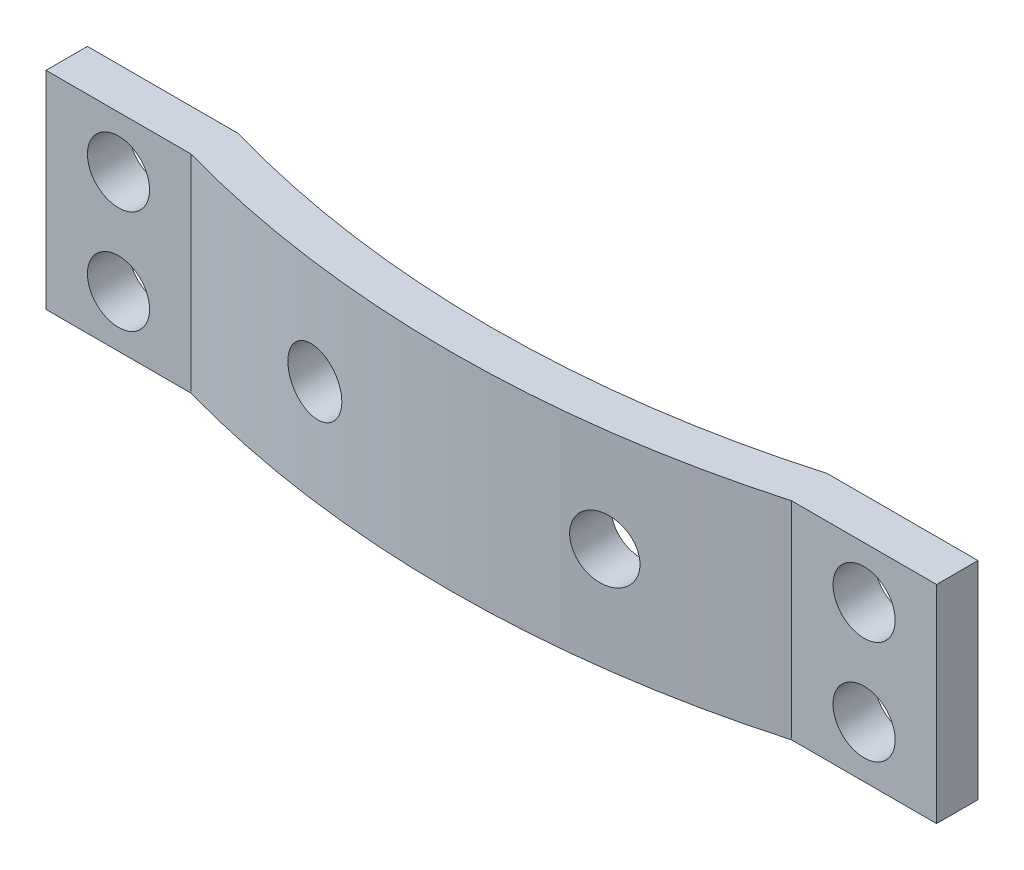
ISO-10303-21;
HEADER;
FILE_DESCRIPTION(('STEP AP214'),'2;1');
FILE_NAME('part.step','',(''),(''),'','','');
FILE_SCHEMA(('AUTOMOTIVE_DESIGN { 1 0 10303 214 1 1 1 1 }'));
ENDSEC;
DATA;
#1=APPLICATION_CONTEXT('core data for automotive mechanical design processes');
#2=APPLICATION_PROTOCOL_DEFINITION('international standard','automotive_design',2000,#1);
#3=PRODUCT_CONTEXT('',#1,'mechanical');
#4=PRODUCT('Part','Part','',(#3));
#5=PRODUCT_RELATED_PRODUCT_CATEGORY('part','',(#4));
#6=PRODUCT_DEFINITION_FORMATION('','',#4);
#7=PRODUCT_DEFINITION_CONTEXT('part definition',#1,'design');
#8=PRODUCT_DEFINITION('design','',#6,#7);
#9=PRODUCT_DEFINITION_SHAPE('','',#8);
#10=(LENGTH_UNIT() NAMED_UNIT(*) SI_UNIT(.MILLI.,.METRE.));
#11=(NAMED_UNIT(*) PLANE_ANGLE_UNIT() SI_UNIT($,.RADIAN.));
#12=(NAMED_UNIT(*) SI_UNIT($,.STERADIAN.) SOLID_ANGLE_UNIT());
#13=UNCERTAINTY_MEASURE_WITH_UNIT(LENGTH_MEASURE(1.E-05),#10,'distance_accuracy_value','');
#14=(GEOMETRIC_REPRESENTATION_CONTEXT(3) GLOBAL_UNCERTAINTY_ASSIGNED_CONTEXT((#13)) GLOBAL_UNIT_ASSIGNED_CONTEXT((#10,
#11,#12)) REPRESENTATION_CONTEXT('',''));
#15=CARTESIAN_POINT('',(0.,0.,0.));
#16=DIRECTION('',(0.,0.,1.));
#17=DIRECTION('',(1.,0.,0.));
#18=AXIS2_PLACEMENT_3D('',#15,#16,#17);
#19=CARTESIAN_POINT('',(-36.,10.,-2.));
#20=DIRECTION('',(0.,0.,1.));
#21=DIRECTION('',(1.,0.,0.));
#22=AXIS2_PLACEMENT_3D('',#19,#20,#21);
#23=PLANE('',#22);
#24=CARTESIAN_POINT('',(-39.5,2.5,-2.));
#25=DIRECTION('',(0.,0.,1.));
#26=DIRECTION('',(1.,0.,0.));
#27=AXIS2_PLACEMENT_3D('',#24,#25,#26);
#28=CIRCLE('',#27,1.5);
#29=CARTESIAN_POINT('',(-38.,2.5,-2.));
#30=VERTEX_POINT('',#29);
#31=EDGE_CURVE('E194',#30,#30,#28,.T.);
#32=ORIENTED_EDGE('',*,*,#31,.T.);
#33=EDGE_LOOP('',(#32));
#34=FACE_BOUND('',#33,.T.);
#35=CARTESIAN_POINT('',(-39.5,7.5,-2.));
#36=DIRECTION('',(0.,0.,1.));
#37=DIRECTION('',(1.,0.,0.));
#38=AXIS2_PLACEMENT_3D('',#35,#36,#37);
#39=CIRCLE('',#38,1.5);
#40=CARTESIAN_POINT('',(-38.,7.5,-2.));
#41=VERTEX_POINT('',#40);
#42=EDGE_CURVE('E141',#41,#41,#39,.T.);
#43=ORIENTED_EDGE('',*,*,#42,.T.);
#44=EDGE_LOOP('',(#43));
#45=FACE_BOUND('',#44,.T.);
#46=DIRECTION('',(-1.,0.,0.));
#47=VECTOR('',#46,1.);
#48=CARTESIAN_POINT('',(-36.,0.,-2.));
#49=LINE('',#48,#47);
#50=CARTESIAN_POINT('',(-35.7214626533279,0.,-2.));
#51=VERTEX_POINT('',#50);
#52=CARTESIAN_POINT('',(-43.,0.,-2.));
#53=VERTEX_POINT('',#52);
#54=EDGE_CURVE('E137',#51,#53,#49,.T.);
#55=ORIENTED_EDGE('',*,*,#54,.T.);
#56=DIRECTION('',(0.,-1.,0.));
#57=VECTOR('',#56,1.);
#58=CARTESIAN_POINT('',(-43.,10.,-2.));
#59=LINE('',#58,#57);
#60=CARTESIAN_POINT('',(-43.,10.,-2.));
#61=VERTEX_POINT('',#60);
#62=EDGE_CURVE('E11',#61,#53,#59,.T.);
#63=ORIENTED_EDGE('',*,*,#62,.F.);
#64=DIRECTION('',(-1.,0.,0.));
#65=VECTOR('',#64,1.);
#66=CARTESIAN_POINT('',(-36.,10.,-2.));
#67=LINE('',#66,#65);
#68=CARTESIAN_POINT('',(-35.7214626533279,10.,-2.));
#69=VERTEX_POINT('',#68);
#70=EDGE_CURVE('E95',#69,#61,#67,.T.);
#71=ORIENTED_EDGE('',*,*,#70,.F.);
#72=DIRECTION('',(0.,-1.,0.));
#73=VECTOR('',#72,1.);
#74=CARTESIAN_POINT('',(-35.7214626533279,10.,-2.));
#75=LINE('',#74,#73);
#76=EDGE_CURVE('E136',#69,#51,#75,.T.);
#77=ORIENTED_EDGE('',*,*,#76,.T.);
#78=EDGE_LOOP('',(#55,#63,#71,#77));
#79=FACE_BOUND('',#78,.T.);
#80=ADVANCED_FACE('F34',(#34,#45,#79),#23,.F.);
#81=CARTESIAN_POINT('',(-43.,10.,0.));
#82=DIRECTION('',(-1.,0.,0.));
#83=DIRECTION('',(0.,0.,1.));
#84=AXIS2_PLACEMENT_3D('',#81,#82,#83);
#85=PLANE('',#84);
#86=DIRECTION('',(0.,0.,-1.));
#87=VECTOR('',#86,1.);
#88=CARTESIAN_POINT('',(-43.,0.,0.));
#89=LINE('',#88,#87);
#90=CARTESIAN_POINT('',(-43.,0.,0.));
#91=VERTEX_POINT('',#90);
#92=EDGE_CURVE('E140',#91,#53,#89,.T.);
#93=ORIENTED_EDGE('',*,*,#92,.F.);
#94=DIRECTION('',(0.,-1.,0.));
#95=VECTOR('',#94,1.);
#96=CARTESIAN_POINT('',(-43.,10.,0.));
#97=LINE('',#96,#95);
#98=CARTESIAN_POINT('',(-43.,10.,0.));
#99=VERTEX_POINT('',#98);
#100=EDGE_CURVE('E47',#99,#91,#97,.T.);
#101=ORIENTED_EDGE('',*,*,#100,.F.);
#102=DIRECTION('',(0.,0.,-1.));
#103=VECTOR('',#102,1.);
#104=CARTESIAN_POINT('',(-43.,10.,0.));
#105=LINE('',#104,#103);
#106=EDGE_CURVE('E227',#99,#61,#105,.T.);
#107=ORIENTED_EDGE('',*,*,#106,.T.);
#108=ORIENTED_EDGE('',*,*,#62,.T.);
#109=EDGE_LOOP('',(#93,#101,#107,#108));
#110=FACE_BOUND('',#109,.T.);
#111=ADVANCED_FACE('F207',(#110),#85,.T.);
#112=CARTESIAN_POINT('',(-36.,10.,0.));
#113=DIRECTION('',(0.,0.,1.));
#114=DIRECTION('',(1.,0.,0.));
#115=AXIS2_PLACEMENT_3D('',#112,#113,#114);
#116=PLANE('',#115);
#117=CARTESIAN_POINT('',(-39.5,2.5,0.));
#118=DIRECTION('',(0.,0.,1.));
#119=DIRECTION('',(1.,0.,0.));
#120=AXIS2_PLACEMENT_3D('',#117,#118,#119);
#121=CIRCLE('',#120,1.5);
#122=CARTESIAN_POINT('',(-38.,2.5,0.));
#123=VERTEX_POINT('',#122);
#124=EDGE_CURVE('E247',#123,#123,#121,.T.);
#125=ORIENTED_EDGE('',*,*,#124,.F.);
#126=EDGE_LOOP('',(#125));
#127=FACE_BOUND('',#126,.T.);
#128=CARTESIAN_POINT('',(-39.5,7.5,0.));
#129=DIRECTION('',(0.,0.,1.));
#130=DIRECTION('',(1.,0.,0.));
#131=AXIS2_PLACEMENT_3D('',#128,#129,#130);
#132=CIRCLE('',#131,1.5);
#133=CARTESIAN_POINT('',(-38.,7.5,0.));
#134=VERTEX_POINT('',#133);
#135=EDGE_CURVE('E232',#134,#134,#132,.T.);
#136=ORIENTED_EDGE('',*,*,#135,.F.);
#137=EDGE_LOOP('',(#136));
#138=FACE_BOUND('',#137,.T.);
#139=DIRECTION('',(-1.,0.,0.));
#140=VECTOR('',#139,1.);
#141=CARTESIAN_POINT('',(-36.,0.,0.));
#142=LINE('',#141,#140);
#143=CARTESIAN_POINT('',(-36.,0.,0.));
#144=VERTEX_POINT('',#143);
#145=EDGE_CURVE('E144',#144,#91,#142,.T.);
#146=ORIENTED_EDGE('',*,*,#145,.F.);
#147=DIRECTION('',(0.,-1.,0.));
#148=VECTOR('',#147,1.);
#149=CARTESIAN_POINT('',(-36.,10.,0.));
#150=LINE('',#149,#148);
#151=CARTESIAN_POINT('',(-36.,10.,0.));
#152=VERTEX_POINT('',#151);
#153=EDGE_CURVE('E161',#152,#144,#150,.T.);
#154=ORIENTED_EDGE('',*,*,#153,.F.);
#155=DIRECTION('',(-1.,0.,0.));
#156=VECTOR('',#155,1.);
#157=CARTESIAN_POINT('',(-36.,10.,0.));
#158=LINE('',#157,#156);
#159=EDGE_CURVE('E225',#152,#99,#158,.T.);
#160=ORIENTED_EDGE('',*,*,#159,.T.);
#161=ORIENTED_EDGE('',*,*,#100,.T.);
#162=EDGE_LOOP('',(#146,#154,#160,#161));
#163=FACE_BOUND('',#162,.T.);
#164=ADVANCED_FACE('F202',(#127,#138,#163),#116,.T.);
#165=CARTESIAN_POINT('',(-21.5,10.,-51.5624999999998));
#166=DIRECTION('',(0.,-1.,0.));
#167=DIRECTION('',(0.,0.,-1.));
#168=AXIS2_PLACEMENT_3D('',#165,#166,#167);
#169=CYLINDRICAL_SURFACE('',#168,53.5624999999998);
#170=CARTESIAN_POINT('',(-13.,5.,1.32125370801509));
#171=CARTESIAN_POINT('',(-13.0000038295987,5.08350273290517,1.32125450287413));
#172=CARTESIAN_POINT('',(-13.006997603703,5.1670661022457,1.32237990367135));
#173=CARTESIAN_POINT('',(-13.0347836727019,5.33187478839652,1.32683454758594));
#174=CARTESIAN_POINT('',(-13.0555925342261,5.41311719983594,1.33016643664436));
#175=CARTESIAN_POINT('',(-13.1103651851401,5.57085656011752,1.338881815141));
#176=CARTESIAN_POINT('',(-13.1443187591815,5.64735714062259,1.34426371137416));
#177=CARTESIAN_POINT('',(-13.2243605847548,5.79352856078542,1.3568427002268));
#178=CARTESIAN_POINT('',(-13.2704462219036,5.86320086745951,1.36403940175312));
#179=CARTESIAN_POINT('',(-13.3737395790866,5.99425430694344,1.3799974640458));
#180=CARTESIAN_POINT('',(-13.4310150178197,6.0555808932154,1.38876832363642));
#181=CARTESIAN_POINT('',(-13.5548638435736,6.16777603702994,1.40749275818143));
#182=CARTESIAN_POINT('',(-13.6214381106637,6.21864360357136,1.41744644506885));
#183=CARTESIAN_POINT('',(-13.7628296223264,6.30908465420686,1.43828072379663));
#184=CARTESIAN_POINT('',(-13.8377326848017,6.34852184821239,1.44917064079154));
#185=CARTESIAN_POINT('',(-13.9930406940018,6.41425014896163,1.47138649723948));
#186=CARTESIAN_POINT('',(-14.073445908263,6.44054061594261,1.48271245788296));
#187=CARTESIAN_POINT('',(-14.2381754944526,6.47941406653153,1.50551555606282));
#188=CARTESIAN_POINT('',(-14.322525984991,6.49188618326322,1.51699317915124));
#189=CARTESIAN_POINT('',(-14.4921613901059,6.5023848851368,1.53965556833142));
#190=CARTESIAN_POINT('',(-14.5774463149114,6.50041131198733,1.55084033121276));
#191=CARTESIAN_POINT('',(-14.7466141728494,6.48203479929442,1.57261520329095));
#192=CARTESIAN_POINT('',(-14.8304956314896,6.46561754968316,1.58320471166699));
#193=CARTESIAN_POINT('',(-14.9943571031426,6.41875724673149,1.60351204399703));
#194=CARTESIAN_POINT('',(-15.074337194396,6.38831447479593,1.61322988543529));
#195=CARTESIAN_POINT('',(-15.2276964327567,6.31440796790959,1.63153684864557));
#196=CARTESIAN_POINT('',(-15.3011055494104,6.27100772666791,1.64013118705279));
#197=CARTESIAN_POINT('',(-15.4396077966744,6.17233364260867,1.65608622630243));
#198=CARTESIAN_POINT('',(-15.5047012322274,6.11706023538923,1.66344697238478));
#199=CARTESIAN_POINT('',(-15.6242279616612,5.99662395033792,1.67677412335198));
#200=CARTESIAN_POINT('',(-15.6787326318952,5.93153294697633,1.68274992065564));
#201=CARTESIAN_POINT('',(-15.7760399001503,5.79302259459375,1.69329865503085));
#202=CARTESIAN_POINT('',(-15.8188428886492,5.71960352359091,1.69787163891403));
#203=CARTESIAN_POINT('',(-15.8912595308513,5.56699864123547,1.70554634233843));
#204=CARTESIAN_POINT('',(-15.9209509532633,5.48785016447795,1.70865674423731));
#205=CARTESIAN_POINT('',(-15.9666450542325,5.32565416711124,1.71342253303805));
#206=CARTESIAN_POINT('',(-15.9826480412156,5.24260673439723,1.71507795272339));
#207=CARTESIAN_POINT('',(-16.0004612815092,5.07529082560028,1.71691968138186));
#208=CARTESIAN_POINT('',(-16.002322403722,4.99102781930192,1.71711125588369));
#209=CARTESIAN_POINT('',(-15.9919317515312,4.8233864760975,1.71603804961144));
#210=CARTESIAN_POINT('',(-15.9796801179699,4.74000813037112,1.71477328337132));
#211=CARTESIAN_POINT('',(-15.9414414357093,4.57658212829385,1.71079723307156));
#212=CARTESIAN_POINT('',(-15.9154672199255,4.49653143534937,1.70808730046255));
#213=CARTESIAN_POINT('',(-15.8505501410572,4.34194027883803,1.70124171641248));
#214=CARTESIAN_POINT('',(-15.8116072447631,4.26739982938226,1.69710606132045));
#215=CARTESIAN_POINT('',(-15.7218086766281,4.12580093315257,1.68743846191633));
#216=CARTESIAN_POINT('',(-15.6709328335752,4.0587554422437,1.6819041521054));
#217=CARTESIAN_POINT('',(-15.5587796170338,3.93416150326796,1.669506174363));
#218=CARTESIAN_POINT('',(-15.4975020610177,3.87661322189151,1.66264248310347));
#219=CARTESIAN_POINT('',(-15.3660213121957,3.7723698135148,1.64765034824773));
#220=CARTESIAN_POINT('',(-15.2957806184363,3.72572276211849,1.63951655669739));
#221=CARTESIAN_POINT('',(-15.1485959252695,3.64487114523664,1.62214588096798));
#222=CARTESIAN_POINT('',(-15.071651717148,3.61066696733199,1.6129089624397));
#223=CARTESIAN_POINT('',(-14.9127235562315,3.55543013864507,1.59345582785529));
#224=CARTESIAN_POINT('',(-14.8307102147787,3.53448414775413,1.58323366188614));
#225=CARTESIAN_POINT('',(-14.6644174048653,3.50665650439948,1.56210108394227));
#226=CARTESIAN_POINT('',(-14.580137839503,3.49977545431136,1.55119064251061));
#227=CARTESIAN_POINT('',(-14.4110995083374,3.50023728961692,1.52889489614785));
#228=CARTESIAN_POINT('',(-14.3263413570256,3.50767669772026,1.51750687847548));
#229=CARTESIAN_POINT('',(-14.1593020805045,3.53674597683569,1.49466417190603));
#230=CARTESIAN_POINT('',(-14.077021036262,3.5583763111674,1.48320948084423));
#231=CARTESIAN_POINT('',(-13.9169570106183,3.615332846723,1.4605650490053));
#232=CARTESIAN_POINT('',(-13.8391915881611,3.65070886869161,1.44937643096672));
#233=CARTESIAN_POINT('',(-13.690708402812,3.73418005078046,1.42770671230719));
#234=CARTESIAN_POINT('',(-13.6199903455053,3.78227467925402,1.41722558213572));
#235=CARTESIAN_POINT('',(-13.4878427097846,3.88969948001779,1.39740182324094));
#236=CARTESIAN_POINT('',(-13.4263863089488,3.94899604108021,1.38805592268018));
#237=CARTESIAN_POINT('',(-13.3143106213949,4.07728927870685,1.37084601096415));
#238=CARTESIAN_POINT('',(-13.2636935130186,4.14628790045982,1.36298229771785));
#239=CARTESIAN_POINT('',(-13.1752488692971,4.29134709539566,1.34914254806955));
#240=CARTESIAN_POINT('',(-13.1373100296249,4.36733831362875,1.34315011570824));
#241=CARTESIAN_POINT('',(-13.0747908521661,4.52468220002861,1.33323015997579));
#242=CARTESIAN_POINT('',(-13.0501932694257,4.60602779377255,1.3292999711568));
#243=CARTESIAN_POINT('',(-13.0217903598045,4.73993745296811,1.32475251500691));
#244=CARTESIAN_POINT('',(-13.0136299476283,4.7915949820905,1.3234429380719));
#245=CARTESIAN_POINT('',(-13.0027335892844,4.89549375870256,1.32169328903503));
#246=CARTESIAN_POINT('',(-12.9999976030249,4.94773500187515,1.32125321050674));
#247=CARTESIAN_POINT('',(-13.,5.,1.32125370801509));
#248=B_SPLINE_CURVE_WITH_KNOTS('',3,(#170,#171,#172,#173,#174,#175,#176,#177,#178,#179,#180,
#181,#182,#183,#184,#185,#186,#187,#188,#189,#190,#191,#192,#193,#194,#195,#196,#197,#198,#199,
#200,#201,#202,#203,#204,#205,#206,#207,#208,#209,#210,#211,#212,#213,#214,#215,#216,#217,#218,
#219,#220,#221,#222,#223,#224,#225,#226,#227,#228,#229,#230,#231,#232,#233,#234,#235,#236,#237,
#238,#239,#240,#241,#242,#243,#244,#245,#246,#247),.UNSPECIFIED.,.T.,.F.,(4,2,2,2,2,2,2,2,2,2,2,
2,2,2,2,2,2,2,2,2,2,2,2,2,2,2,2,2,2,2,2,2,2,2,2,2,2,2,4),(0.,0.25031606291187,0.500932840671837,
0.751355242558346,1.00172372410846,1.2536571487646,1.50561443334171,1.76046277558866,
2.0153235183826,2.27221456746852,2.52910843149066,2.78625710000673,3.04340060937575,
3.29930419630943,3.5551983963542,3.80930278220291,4.06339868771071,4.31596653750394,
4.56852869632437,4.82018194605805,5.0718326843708,5.32324850253331,5.57466496452004,
5.82650951826805,6.07835849179993,6.33129802637701,6.58424543904908,6.83882957556617,
7.09342461522593,7.34974168577098,7.60606712522972,7.86333040571199,8.12058293410817,
8.37707549940981,8.63361956302245,8.88784828998772,9.14174761209696,9.2984235051952,
9.45509824030318),.UNSPECIFIED.);
#249=CARTESIAN_POINT('',(-13.,5.,1.32125370801509));
#250=VERTEX_POINT('',#249);
#251=EDGE_CURVE('E169',#250,#250,#248,.T.);
#252=ORIENTED_EDGE('',*,*,#251,.F.);
#253=EDGE_LOOP('',(#252));
#254=FACE_BOUND('',#253,.T.);
#255=CARTESIAN_POINT('',(-27.,5.,1.71687130118936));
#256=CARTESIAN_POINT('',(-27.000003758659,5.08389991530143,1.71687109194264));
#257=CARTESIAN_POINT('',(-27.0070633852415,5.16786040950531,1.71614361807879));
#258=CARTESIAN_POINT('',(-27.0351208729197,5.33346390242183,1.71323588769049));
#259=CARTESIAN_POINT('',(-27.0561354053986,5.41510400725764,1.71105389349524));
#260=CARTESIAN_POINT('',(-27.1114827309356,5.57363912630241,1.70525232229102));
#261=CARTESIAN_POINT('',(-27.1458080301429,5.65053678228671,1.7016335541465));
#262=CARTESIAN_POINT('',(-27.2267662258821,5.79743903231283,1.69298989522635));
#263=CARTESIAN_POINT('',(-27.2733961416213,5.86744529016349,1.68796534498359));
#264=CARTESIAN_POINT('',(-27.3777201118358,5.99876615882728,1.67655111098463));
#265=CARTESIAN_POINT('',(-27.4354363780894,6.06006288354627,1.67015868367068));
#266=CARTESIAN_POINT('',(-27.5602063895358,6.17210021199962,1.65609861091339));
#267=CARTESIAN_POINT('',(-27.6272606891349,6.22284018852523,1.64843088974962));
#268=CARTESIAN_POINT('',(-27.7691484750899,6.312607821454,1.63190104847318));
#269=CARTESIAN_POINT('',(-27.8440198295894,6.35157453148912,1.62303304605785));
#270=CARTESIAN_POINT('',(-27.9991203750385,6.41639862840728,1.60430296347813));
#271=CARTESIAN_POINT('',(-28.0793497510736,6.44225556216565,1.59444084896749));
#272=CARTESIAN_POINT('',(-28.2434679763072,6.48031599331751,1.57387104345943));
#273=CARTESIAN_POINT('',(-28.3273781276805,6.492424754975,1.56315802319947));
#274=CARTESIAN_POINT('',(-28.4959737826818,6.50236997129394,1.54121911402336));
#275=CARTESIAN_POINT('',(-28.580659315987,6.50020587737403,1.52999320541066));
#276=CARTESIAN_POINT('',(-28.7489595644234,6.48163108385717,1.50727715477248));
#277=CARTESIAN_POINT('',(-28.8325643928239,6.46513218981554,1.49578580647519));
#278=CARTESIAN_POINT('',(-28.9958061222063,6.41823429570884,1.4729701496125));
#279=CARTESIAN_POINT('',(-29.075442928222,6.38783496314351,1.46164584504952));
#280=CARTESIAN_POINT('',(-29.2286367096303,6.31390083486393,1.43953380640449));
#281=CARTESIAN_POINT('',(-29.3021820774805,6.27034166427065,1.4287471116582));
#282=CARTESIAN_POINT('',(-29.440909461514,6.1713036594209,1.4081361001733));
#283=CARTESIAN_POINT('',(-29.5060916341452,6.11582504818965,1.39831176543292));
#284=CARTESIAN_POINT('',(-29.6258683747611,5.99480204240286,1.38006632646854));
#285=CARTESIAN_POINT('',(-29.6805159620067,5.92931119614988,1.37163822703875));
#286=CARTESIAN_POINT('',(-29.7780092430192,5.78989030931839,1.35647969153073));
#287=CARTESIAN_POINT('',(-29.8208556536773,5.71596078175418,1.34974915233215));
#288=CARTESIAN_POINT('',(-29.8930428976318,5.56261479122249,1.33834654108906));
#289=CARTESIAN_POINT('',(-29.9225249353323,5.48326640282172,1.33365297067507));
#290=CARTESIAN_POINT('',(-29.9677540135066,5.32065374126345,1.32643152635076));
#291=CARTESIAN_POINT('',(-29.983501982627,5.23738973326686,1.32390350601421));
#292=CARTESIAN_POINT('',(-30.0006836497381,5.07024133529661,1.32114453874912));
#293=CARTESIAN_POINT('',(-30.002265005231,4.98637248604559,1.32088989667366));
#294=CARTESIAN_POINT('',(-29.9914517826618,4.81956619912133,1.32262722797296));
#295=CARTESIAN_POINT('',(-29.9790576145506,4.7366287341994,1.32461913544858));
#296=CARTESIAN_POINT('',(-29.9407373993283,4.57431600760918,1.33074842735527));
#297=CARTESIAN_POINT('',(-29.9148559551938,4.49492993533094,1.33487873970293));
#298=CARTESIAN_POINT('',(-29.8503645786736,4.34164606667617,1.34509753958229));
#299=CARTESIAN_POINT('',(-29.8117543428151,4.26774840120265,1.35118607380074));
#300=CARTESIAN_POINT('',(-29.7226712531649,4.1270453358144,1.36510263335477));
#301=CARTESIAN_POINT('',(-29.6721286513538,4.06028512340768,1.37294087093564));
#302=CARTESIAN_POINT('',(-29.5607696079673,3.93617666541409,1.39001235844108));
#303=CARTESIAN_POINT('',(-29.4999525644524,3.87882897165824,1.39924569009542));
#304=CARTESIAN_POINT('',(-29.3690245349479,3.77448709795985,1.41885786636815));
#305=CARTESIAN_POINT('',(-29.2988166746253,3.72761667461984,1.42924843114575));
#306=CARTESIAN_POINT('',(-29.1516261625136,3.64631866960649,1.45070164731788));
#307=CARTESIAN_POINT('',(-29.0746431344818,3.61189177949753,1.46176433602662));
#308=CARTESIAN_POINT('',(-28.9152748730296,3.55613664900504,1.48428724545751));
#309=CARTESIAN_POINT('',(-28.8328447205357,3.53493786418355,1.49575027014025));
#310=CARTESIAN_POINT('',(-28.6655772085899,3.50675593452664,1.51859863762907));
#311=CARTESIAN_POINT('',(-28.5807397837891,3.49977317598059,1.52998397831588));
#312=CARTESIAN_POINT('',(-28.4107733492117,3.50023881655486,1.5523753962598));
#313=CARTESIAN_POINT('',(-28.3256442810603,3.50773380751326,1.56338013264284));
#314=CARTESIAN_POINT('',(-28.1578018848171,3.53707209793674,1.58467526943028));
#315=CARTESIAN_POINT('',(-28.0750885315165,3.55891524761893,1.59496567729044));
#316=CARTESIAN_POINT('',(-27.9147368560426,3.61627549621585,1.61455393621647));
#317=CARTESIAN_POINT('',(-27.8370824988414,3.65174665864517,1.62385498908504));
#318=CARTESIAN_POINT('',(-27.6888116980982,3.73539818242865,1.64131184775316));
#319=CARTESIAN_POINT('',(-27.6181947431117,3.78357761927753,1.64946773679531));
#320=CARTESIAN_POINT('',(-27.4865278074654,3.89092808505578,1.66444111262293));
#321=CARTESIAN_POINT('',(-27.4254157694432,3.95002178152786,1.67126736153494));
#322=CARTESIAN_POINT('',(-27.313965144396,4.07777099131457,1.68355495595761));
#323=CARTESIAN_POINT('',(-27.2636288553144,4.14642853899111,1.68901601038022));
#324=CARTESIAN_POINT('',(-27.1755116424796,4.29088184661316,1.6984794521806));
#325=CARTESIAN_POINT('',(-27.1376562953829,4.36663170326908,1.70249050025537));
#326=CARTESIAN_POINT('',(-27.0752328206547,4.52340750849891,1.70906070499648));
#327=CARTESIAN_POINT('',(-27.0506483784619,4.60442684105637,1.71162164454156));
#328=CARTESIAN_POINT('',(-27.0220656416335,4.73830952103713,1.71458991512928));
#329=CARTESIAN_POINT('',(-27.013801705513,4.79029118813741,1.71544504529461));
#330=CARTESIAN_POINT('',(-27.0027677133723,4.89484063679535,1.71658580321093));
#331=CARTESIAN_POINT('',(-26.9999976439329,4.94740841692105,1.71687143235297));
#332=CARTESIAN_POINT('',(-27.,5.,1.71687130118936));
#333=B_SPLINE_CURVE_WITH_KNOTS('',3,(#255,#256,#257,#258,#259,#260,#261,#262,#263,#264,#265,
#266,#267,#268,#269,#270,#271,#272,#273,#274,#275,#276,#277,#278,#279,#280,#281,#282,#283,#284,
#285,#286,#287,#288,#289,#290,#291,#292,#293,#294,#295,#296,#297,#298,#299,#300,#301,#302,#303,
#304,#305,#306,#307,#308,#309,#310,#311,#312,#313,#314,#315,#316,#317,#318,#319,#320,#321,#322,
#323,#324,#325,#326,#327,#328,#329,#330,#331,#332),.UNSPECIFIED.,.T.,.F.,(4,2,2,2,2,2,2,2,2,2,2,
2,2,2,2,2,2,2,2,2,2,2,2,2,2,2,2,2,2,2,2,2,2,2,2,2,2,2,4),(0.,0.251507401355051,
0.503315810669441,0.754982659287524,1.00658859750674,1.25870399400421,1.51083436517489,
1.76424841151112,2.01767121622155,2.27282990246475,2.5279983958634,2.78474801295379,
3.04150377184906,3.29873804457356,3.55596750459444,3.81186647614044,4.06774989905075,
4.32086282855129,4.57395864217026,4.82441334908903,5.07486070948625,5.32448503744325,
5.57411531723471,5.82524255269479,6.07638450582414,6.33035226974829,6.58433414606778,
6.84076413641799,7.09720109459843,7.35446468517555,7.61172559017652,7.86812683754166,
8.12450943729593,8.37914067175674,8.63382615270806,8.88696426601192,9.13979047162911,
9.29744503724539,9.45509921777484),.UNSPECIFIED.);
#334=CARTESIAN_POINT('',(-27.,5.,1.71687130118936));
#335=VERTEX_POINT('',#334);
#336=EDGE_CURVE('E168',#335,#335,#333,.T.);
#337=ORIENTED_EDGE('',*,*,#336,.F.);
#338=EDGE_LOOP('',(#337));
#339=FACE_BOUND('',#338,.T.);
#340=CARTESIAN_POINT('',(-21.5,0.,-51.5624999999998));
#341=DIRECTION('',(0.,-1.,0.));
#342=DIRECTION('',(0.,0.,-1.));
#343=AXIS2_PLACEMENT_3D('',#340,#341,#342);
#344=CIRCLE('',#343,53.5624999999998);
#345=CARTESIAN_POINT('',(-7.,0.,0.));
#346=VERTEX_POINT('',#345);
#347=EDGE_CURVE('E147',#346,#144,#344,.T.);
#348=ORIENTED_EDGE('',*,*,#347,.F.);
#349=DIRECTION('',(0.,-1.,0.));
#350=VECTOR('',#349,1.);
#351=CARTESIAN_POINT('',(-7.,10.,0.));
#352=LINE('',#351,#350);
#353=CARTESIAN_POINT('',(-7.,10.,0.));
#354=VERTEX_POINT('',#353);
#355=EDGE_CURVE('E159',#354,#346,#352,.T.);
#356=ORIENTED_EDGE('',*,*,#355,.F.);
#357=CARTESIAN_POINT('',(-21.5,10.,-51.5624999999998));
#358=DIRECTION('',(0.,-1.,0.));
#359=DIRECTION('',(0.,0.,-1.));
#360=AXIS2_PLACEMENT_3D('',#357,#358,#359);
#361=CIRCLE('',#360,53.5624999999998);
#362=EDGE_CURVE('E131',#354,#152,#361,.T.);
#363=ORIENTED_EDGE('',*,*,#362,.T.);
#364=ORIENTED_EDGE('',*,*,#153,.T.);
#365=EDGE_LOOP('',(#348,#356,#363,#364));
#366=FACE_BOUND('',#365,.T.);
#367=ADVANCED_FACE('F196',(#254,#339,#366),#169,.T.);
#368=CARTESIAN_POINT('',(0.,10.,0.));
#369=DIRECTION('',(0.,0.,1.));
#370=DIRECTION('',(1.,0.,0.));
#371=AXIS2_PLACEMENT_3D('',#368,#369,#370);
#372=PLANE('',#371);
#373=CARTESIAN_POINT('',(-3.5,7.5,0.));
#374=DIRECTION('',(0.,0.,1.));
#375=DIRECTION('',(1.,0.,0.));
#376=AXIS2_PLACEMENT_3D('',#373,#374,#375);
#377=CIRCLE('',#376,1.5);
#378=CARTESIAN_POINT('',(-2.,7.5,0.));
#379=VERTEX_POINT('',#378);
#380=EDGE_CURVE('E242',#379,#379,#377,.T.);
#381=ORIENTED_EDGE('',*,*,#380,.F.);
#382=EDGE_LOOP('',(#381));
#383=FACE_BOUND('',#382,.T.);
#384=CARTESIAN_POINT('',(-3.5,2.5,0.));
#385=DIRECTION('',(0.,0.,1.));
#386=DIRECTION('',(1.,0.,0.));
#387=AXIS2_PLACEMENT_3D('',#384,#385,#386);
#388=CIRCLE('',#387,1.5);
#389=CARTESIAN_POINT('',(-2.,2.5,0.));
#390=VERTEX_POINT('',#389);
#391=EDGE_CURVE('E191',#390,#390,#388,.T.);
#392=ORIENTED_EDGE('',*,*,#391,.F.);
#393=EDGE_LOOP('',(#392));
#394=FACE_BOUND('',#393,.T.);
#395=DIRECTION('',(-1.,0.,0.));
#396=VECTOR('',#395,1.);
#397=CARTESIAN_POINT('',(0.,0.,0.));
#398=LINE('',#397,#396);
#399=CARTESIAN_POINT('',(0.,0.,0.));
#400=VERTEX_POINT('',#399);
#401=EDGE_CURVE('E150',#400,#346,#398,.T.);
#402=ORIENTED_EDGE('',*,*,#401,.F.);
#403=DIRECTION('',(0.,-1.,0.));
#404=VECTOR('',#403,1.);
#405=CARTESIAN_POINT('',(0.,10.,0.));
#406=LINE('',#405,#404);
#407=CARTESIAN_POINT('',(0.,10.,0.));
#408=VERTEX_POINT('',#407);
#409=EDGE_CURVE('E119',#408,#400,#406,.T.);
#410=ORIENTED_EDGE('',*,*,#409,.F.);
#411=DIRECTION('',(-1.,0.,0.));
#412=VECTOR('',#411,1.);
#413=CARTESIAN_POINT('',(0.,10.,0.));
#414=LINE('',#413,#412);
#415=EDGE_CURVE('E129',#408,#354,#414,.T.);
#416=ORIENTED_EDGE('',*,*,#415,.T.);
#417=ORIENTED_EDGE('',*,*,#355,.T.);
#418=EDGE_LOOP('',(#402,#410,#416,#417));
#419=FACE_BOUND('',#418,.T.);
#420=ADVANCED_FACE('F201',(#383,#394,#419),#372,.T.);
#421=CARTESIAN_POINT('',(0.,10.,-2.));
#422=DIRECTION('',(1.,0.,0.));
#423=DIRECTION('',(0.,0.,-1.));
#424=AXIS2_PLACEMENT_3D('',#421,#422,#423);
#425=PLANE('',#424);
#426=DIRECTION('',(0.,0.,1.));
#427=VECTOR('',#426,1.);
#428=CARTESIAN_POINT('',(0.,0.,-2.));
#429=LINE('',#428,#427);
#430=CARTESIAN_POINT('',(0.,0.,-2.));
#431=VERTEX_POINT('',#430);
#432=EDGE_CURVE('E118',#431,#400,#429,.T.);
#433=ORIENTED_EDGE('',*,*,#432,.F.);
#434=DIRECTION('',(0.,-1.,0.));
#435=VECTOR('',#434,1.);
#436=CARTESIAN_POINT('',(0.,10.,-2.));
#437=LINE('',#436,#435);
#438=CARTESIAN_POINT('',(0.,10.,-2.));
#439=VERTEX_POINT('',#438);
#440=EDGE_CURVE('E112',#439,#431,#437,.T.);
#441=ORIENTED_EDGE('',*,*,#440,.F.);
#442=DIRECTION('',(0.,0.,1.));
#443=VECTOR('',#442,1.);
#444=CARTESIAN_POINT('',(0.,10.,-2.));
#445=LINE('',#444,#443);
#446=EDGE_CURVE('E116',#439,#408,#445,.T.);
#447=ORIENTED_EDGE('',*,*,#446,.T.);
#448=ORIENTED_EDGE('',*,*,#409,.T.);
#449=EDGE_LOOP('',(#433,#441,#447,#448));
#450=FACE_BOUND('',#449,.T.);
#451=ADVANCED_FACE('F114',(#450),#425,.T.);
#452=CARTESIAN_POINT('',(0.,10.,-2.));
#453=DIRECTION('',(0.,0.,1.));
#454=DIRECTION('',(1.,0.,0.));
#455=AXIS2_PLACEMENT_3D('',#452,#453,#454);
#456=PLANE('',#455);
#457=CARTESIAN_POINT('',(-3.5,7.5,-2.));
#458=DIRECTION('',(0.,0.,1.));
#459=DIRECTION('',(1.,0.,0.));
#460=AXIS2_PLACEMENT_3D('',#457,#458,#459);
#461=CIRCLE('',#460,1.5);
#462=CARTESIAN_POINT('',(-2.,7.5,-2.));
#463=VERTEX_POINT('',#462);
#464=EDGE_CURVE('E245',#463,#463,#461,.T.);
#465=ORIENTED_EDGE('',*,*,#464,.T.);
#466=EDGE_LOOP('',(#465));
#467=FACE_BOUND('',#466,.T.);
#468=CARTESIAN_POINT('',(-3.5,2.5,-2.));
#469=DIRECTION('',(0.,0.,1.));
#470=DIRECTION('',(1.,0.,0.));
#471=AXIS2_PLACEMENT_3D('',#468,#469,#470);
#472=CIRCLE('',#471,1.5);
#473=CARTESIAN_POINT('',(-2.,2.5,-2.));
#474=VERTEX_POINT('',#473);
#475=EDGE_CURVE('E239',#474,#474,#472,.T.);
#476=ORIENTED_EDGE('',*,*,#475,.T.);
#477=EDGE_LOOP('',(#476));
#478=FACE_BOUND('',#477,.T.);
#479=DIRECTION('',(-1.,0.,0.));
#480=VECTOR('',#479,1.);
#481=CARTESIAN_POINT('',(0.,0.,-2.));
#482=LINE('',#481,#480);
#483=CARTESIAN_POINT('',(-7.27853734667214,0.,-2.));
#484=VERTEX_POINT('',#483);
#485=EDGE_CURVE('E83',#431,#484,#482,.T.);
#486=ORIENTED_EDGE('',*,*,#485,.T.);
#487=DIRECTION('',(0.,-1.,0.));
#488=VECTOR('',#487,1.);
#489=CARTESIAN_POINT('',(-7.27853734667214,10.,-2.));
#490=LINE('',#489,#488);
#491=CARTESIAN_POINT('',(-7.27853734667214,10.,-2.));
#492=VERTEX_POINT('',#491);
#493=EDGE_CURVE('E120',#492,#484,#490,.T.);
#494=ORIENTED_EDGE('',*,*,#493,.F.);
#495=DIRECTION('',(-1.,0.,0.));
#496=VECTOR('',#495,1.);
#497=CARTESIAN_POINT('',(0.,10.,-2.));
#498=LINE('',#497,#496);
#499=EDGE_CURVE('E122',#439,#492,#498,.T.);
#500=ORIENTED_EDGE('',*,*,#499,.F.);
#501=ORIENTED_EDGE('',*,*,#440,.T.);
#502=EDGE_LOOP('',(#486,#494,#500,#501));
#503=FACE_BOUND('',#502,.T.);
#504=ADVANCED_FACE('F123',(#467,#478,#503),#456,.F.);
#505=CARTESIAN_POINT('',(-21.5,10.,-51.5624999999998));
#506=DIRECTION('',(0.,-1.,0.));
#507=DIRECTION('',(0.,0.,-1.));
#508=AXIS2_PLACEMENT_3D('',#505,#506,#507);
#509=CYLINDRICAL_SURFACE('',#508,51.5624999999998);
#510=CARTESIAN_POINT('',(-13.,5.,-0.705431599924096));
#511=CARTESIAN_POINT('',(-13.0000038369271,5.08344289903505,-0.705430772355467));
#512=CARTESIAN_POINT('',(-13.0069876994427,5.16694640492666,-0.704262181256468));
#513=CARTESIAN_POINT('',(-13.0347330824973,5.33163568159923,-0.699636807100263));
#514=CARTESIAN_POINT('',(-13.0555111438464,5.41281854761807,-0.696177276959676));
#515=CARTESIAN_POINT('',(-13.1101982187333,5.57043960346788,-0.687128793057074));
#516=CARTESIAN_POINT('',(-13.1440967236379,5.64688153377825,-0.681541543519292));
#517=CARTESIAN_POINT('',(-13.2240023216412,5.79294392927949,-0.668483656009254));
#518=CARTESIAN_POINT('',(-13.2700068369355,5.86256584237113,-0.661013419006902));
#519=CARTESIAN_POINT('',(-13.3731361383271,5.99356596128086,-0.644445955011542));
#520=CARTESIAN_POINT('',(-13.4303337314042,6.05488548877427,-0.63533810927702));
#521=CARTESIAN_POINT('',(-13.5540119881318,6.1670816176264,-0.615894693406081));
#522=CARTESIAN_POINT('',(-13.6204935694807,6.21795718539722,-0.605559001915381));
#523=CARTESIAN_POINT('',(-13.7617531148347,6.30847810216961,-0.583915262741257));
#524=CARTESIAN_POINT('',(-13.8366236864479,6.34797645900322,-0.572596751939601));
#525=CARTESIAN_POINT('',(-13.99187281662,6.41383083999018,-0.549505707631941));
#526=CARTESIAN_POINT('',(-14.0722516652531,6.44018617140597,-0.537733150229448));
#527=CARTESIAN_POINT('',(-14.2369917359601,6.47920688818288,-0.514022089070323));
#528=CARTESIAN_POINT('',(-14.3213812905005,6.49175243363199,-0.502083029280824));
#529=CARTESIAN_POINT('',(-14.4911096138365,6.50238188851365,-0.478508358889138));
#530=CARTESIAN_POINT('',(-14.5764483940702,6.50046562349345,-0.466872751949199));
#531=CARTESIAN_POINT('',(-14.7457451155789,6.4821827550479,-0.444218044734103));
#532=CARTESIAN_POINT('',(-14.8297014619668,6.46580051019191,-0.433199625514715));
#533=CARTESIAN_POINT('',(-14.9937212646282,6.41898284620647,-0.412069066866812));
#534=CARTESIAN_POINT('',(-15.0737848055355,6.3885477327529,-0.401956907731174));
#535=CARTESIAN_POINT('',(-15.2272827630101,6.31463990013622,-0.382910494213899));
#536=CARTESIAN_POINT('',(-15.3007494977697,6.2712358263611,-0.373970386001676));
#537=CARTESIAN_POINT('',(-15.4393665179468,6.17253098982919,-0.357373220179801));
#538=CARTESIAN_POINT('',(-15.5045171329609,6.11723069879424,-0.349716111716647));
#539=CARTESIAN_POINT('',(-15.6241159117532,5.99675174419908,-0.335856558374346));
#540=CARTESIAN_POINT('',(-15.6786412001549,5.93165085304106,-0.329643562455787));
#541=CARTESIAN_POINT('',(-15.7759876574758,5.79310917993147,-0.318676016130701));
#542=CARTESIAN_POINT('',(-15.8188092488428,5.71966869913501,-0.313921413082348));
#543=CARTESIAN_POINT('',(-15.8912385776319,5.56704847086209,-0.305944057531235));
#544=CARTESIAN_POINT('',(-15.9209303352398,5.48790909940436,-0.302711555926247));
#545=CARTESIAN_POINT('',(-15.9666282350812,5.32572810659655,-0.297758352575048));
#546=CARTESIAN_POINT('',(-15.9826347104811,5.24268658029588,-0.296037614025125));
#547=CARTESIAN_POINT('',(-16.0004539612644,5.07540472960667,-0.294122990896373));
#548=CARTESIAN_POINT('',(-16.0023216591522,4.99117031874037,-0.293923198141087));
#549=CARTESIAN_POINT('',(-15.9919535973204,4.82358473941327,-0.295036075287519));
#550=CARTESIAN_POINT('',(-15.9797179896036,4.74023356144292,-0.29634872888836));
#551=CARTESIAN_POINT('',(-15.9415226805328,4.57686604022154,-0.300476037571773));
#552=CARTESIAN_POINT('',(-15.9155768336493,4.49684641826961,-0.30328917641097));
#553=CARTESIAN_POINT('',(-15.8507293189947,4.34231325255315,-0.310395606421779));
#554=CARTESIAN_POINT('',(-15.8118276152475,4.26779972407881,-0.314688901703537));
#555=CARTESIAN_POINT('',(-15.7221192483488,4.12623847188005,-0.324725524269561));
#556=CARTESIAN_POINT('',(-15.6712908506747,4.0592047119137,-0.33047150033423));
#557=CARTESIAN_POINT('',(-15.559244205153,3.93462646050948,-0.343343440957399));
#558=CARTESIAN_POINT('',(-15.4980257611042,3.8770821483067,-0.350469431575855));
#559=CARTESIAN_POINT('',(-15.3666527468523,3.77281695737739,-0.366036793248554));
#560=CARTESIAN_POINT('',(-15.2964577667538,3.72614789711927,-0.374484153704141));
#561=CARTESIAN_POINT('',(-15.1493705231527,3.64524400045113,-0.392524474466644));
#562=CARTESIAN_POINT('',(-15.0724780345476,3.61100958216809,-0.402117473282358));
#563=CARTESIAN_POINT('',(-14.9136171310564,3.55568551655477,-0.422325801988832));
#564=CARTESIAN_POINT('',(-14.8316170231196,3.53468931935627,-0.432947802444071));
#565=CARTESIAN_POINT('',(-14.6653490892069,3.50675956848044,-0.454907769376271));
#566=CARTESIAN_POINT('',(-14.5810811590626,3.49982666189677,-0.466245768773714));
#567=CARTESIAN_POINT('',(-14.4120158422639,3.50018121768093,-0.489422757651076));
#568=CARTESIAN_POINT('',(-14.3272190848599,3.50757293263241,-0.501264801899809));
#569=CARTESIAN_POINT('',(-14.1600973240507,3.53655908393728,-0.525020025060945));
#570=CARTESIAN_POINT('',(-14.0777724076837,3.55815401980128,-0.536933206460557));
#571=CARTESIAN_POINT('',(-13.9175902388302,3.61506266718465,-0.560489722290784));
#572=CARTESIAN_POINT('',(-13.8397519824176,3.65043040117824,-0.572131800374978));
#573=CARTESIAN_POINT('',(-13.6911229255053,3.7339107021244,-0.594681701980396));
#574=CARTESIAN_POINT('',(-13.6203318303747,3.78202273594928,-0.605589556192208));
#575=CARTESIAN_POINT('',(-13.4880573702254,3.88949950921053,-0.626219644857658));
#576=CARTESIAN_POINT('',(-13.4265452552943,3.94882815178409,-0.635945522541107));
#577=CARTESIAN_POINT('',(-13.3143664025778,4.07721139727395,-0.653855890293817));
#578=CARTESIAN_POINT('',(-13.2637018022202,4.14626791256423,-0.662040076545309));
#579=CARTESIAN_POINT('',(-13.1752134378937,4.29141154462288,-0.676437747711237));
#580=CARTESIAN_POINT('',(-13.1372689323172,4.36742329398182,-0.682669723924578));
#581=CARTESIAN_POINT('',(-13.0747436127862,4.52481951809232,-0.692985795347044));
#582=CARTESIAN_POINT('',(-13.0501454436031,4.60619686028985,-0.69707267975089));
#583=CARTESIAN_POINT('',(-13.0217617514894,4.74010729717375,-0.70179814294908));
#584=CARTESIAN_POINT('',(-13.0136121145094,4.7917308352772,-0.703158107433045));
#585=CARTESIAN_POINT('',(-13.0027300594908,4.89556166984485,-0.704975091330445));
#586=CARTESIAN_POINT('',(-12.9999975982775,4.94776896165323,-0.70543211794024));
#587=CARTESIAN_POINT('',(-13.,5.,-0.705431599924096));
#588=B_SPLINE_CURVE_WITH_KNOTS('',3,(#510,#511,#512,#513,#514,#515,#516,#517,#518,#519,#520,
#521,#522,#523,#524,#525,#526,#527,#528,#529,#530,#531,#532,#533,#534,#535,#536,#537,#538,#539,
#540,#541,#542,#543,#544,#545,#546,#547,#548,#549,#550,#551,#552,#553,#554,#555,#556,#557,#558,
#559,#560,#561,#562,#563,#564,#565,#566,#567,#568,#569,#570,#571,#572,#573,#574,#575,#576,#577,
#578,#579,#580,#581,#582,#583,#584,#585,#586,#587),.UNSPECIFIED.,.T.,.F.,(4,2,2,2,2,2,2,2,2,2,2,
2,2,2,2,2,2,2,2,2,2,2,2,2,2,2,2,2,2,2,2,2,2,2,2,2,2,2,4),(0.,0.250136574163967,
0.500573633541847,0.75081052260112,1.00099417029605,1.25286277462686,1.50475629316478,
1.75977157383314,2.01480029432938,2.27202509520494,2.52925299898698,2.78675937307131,
3.04426014617925,3.30042139709452,3.55657249229511,3.81078872779122,4.0649957860742,
4.31755171660319,4.57010149851412,4.82166973734548,5.07323526484474,5.32454706513334,
5.5758595632783,5.8276336453213,6.07941248228621,6.33236752656971,6.5853310759263,
6.84006089979708,7.0948024442759,7.35140492603221,7.60801643267931,7.86564477940334,
8.12326235055542,8.38006455985526,8.63691732378449,8.89125797630399,9.14526709331804,
9.30184119699671,9.45841405278402),.UNSPECIFIED.);
#589=CARTESIAN_POINT('',(-13.,5.,-0.705431599924096));
#590=VERTEX_POINT('',#589);
#591=EDGE_CURVE('E37',#590,#590,#588,.T.);
#592=ORIENTED_EDGE('',*,*,#591,.T.);
#593=EDGE_LOOP('',(#592));
#594=FACE_BOUND('',#593,.T.);
#595=CARTESIAN_POINT('',(-27.,5.,-0.294172484369061));
#596=CARTESIAN_POINT('',(-27.000003760506,5.08387171133911,-0.294172702149898));
#597=CARTESIAN_POINT('',(-27.0070586828933,5.16780396652579,-0.294928207771014));
#598=CARTESIAN_POINT('',(-27.0350969375811,5.33335135359387,-0.297947927051605));
#599=CARTESIAN_POINT('',(-27.0560969227456,5.41496359330929,-0.300213944541019));
#600=CARTESIAN_POINT('',(-27.1114040381797,5.57344381232591,-0.306238722341144));
#601=CARTESIAN_POINT('',(-27.145703590802,5.65031446436841,-0.309996632650415));
#602=CARTESIAN_POINT('',(-27.2265977617145,5.79716604250346,-0.318972288324203));
#603=CARTESIAN_POINT('',(-27.2731894083376,5.86714862820892,-0.324189680870889));
#604=CARTESIAN_POINT('',(-27.3774308907081,5.9984384247462,-0.336042366314345));
#605=CARTESIAN_POINT('',(-27.4351045684491,6.05972642660935,-0.342680719856043));
#606=CARTESIAN_POINT('',(-27.5597778189157,6.17175365611543,-0.357281220500131));
#607=CARTESIAN_POINT('',(-27.6267779599439,6.2224922404654,-0.365243448277804));
#608=CARTESIAN_POINT('',(-27.7685746039355,6.31228720065345,-0.382411109078679));
#609=CARTESIAN_POINT('',(-27.8434119274087,6.3512778462441,-0.391623133516047));
#610=CARTESIAN_POINT('',(-27.9984392755143,6.41615622955493,-0.411079772043535));
#611=CARTESIAN_POINT('',(-28.0786295001198,6.44204347744984,-0.421324424717732));
#612=CARTESIAN_POINT('',(-28.2427109427178,6.48018539559001,-0.442698100437401));
#613=CARTESIAN_POINT('',(-28.3266251389747,6.49233786677139,-0.453833101618894));
#614=CARTESIAN_POINT('',(-28.4952307178653,6.50236823973203,-0.476637075729706));
#615=CARTESIAN_POINT('',(-28.5799221326778,6.50024554779657,-0.488306070848184));
#616=CARTESIAN_POINT('',(-28.7482806913157,6.48174761470503,-0.51192597755613));
#617=CARTESIAN_POINT('',(-28.8319371815637,6.46527704815716,-0.523878253534238));
#618=CARTESIAN_POINT('',(-28.9952852282697,6.41841903234245,-0.547610779864285));
#619=CARTESIAN_POINT('',(-29.0749766820942,6.38803122304073,-0.55939102575772));
#620=CARTESIAN_POINT('',(-29.2282943799786,6.31409471171687,-0.582397023203257));
#621=CARTESIAN_POINT('',(-29.3019080075929,6.27051946796204,-0.593621602880429));
#622=CARTESIAN_POINT('',(-29.4407677187816,6.17142265107499,-0.615070644252372));
#623=CARTESIAN_POINT('',(-29.5060139703058,6.1159013177843,-0.625295126020105));
#624=CARTESIAN_POINT('',(-29.6258833085521,5.9947891425751,-0.644280299741704));
#625=CARTESIAN_POINT('',(-29.6805635839861,5.92925615566341,-0.653048833512351));
#626=CARTESIAN_POINT('',(-29.77811206584,5.7897301878341,-0.668819481549576));
#627=CARTESIAN_POINT('',(-29.82098104993,5.71573776435047,-0.675821712109201));
#628=CARTESIAN_POINT('',(-29.8931632143669,5.56231618490855,-0.687677677221382));
#629=CARTESIAN_POINT('',(-29.922629060796,5.48296072843705,-0.6925555798138));
#630=CARTESIAN_POINT('',(-29.9678250811878,5.32032928972905,-0.700059291898544));
#631=CARTESIAN_POINT('',(-29.9835562606183,5.23705359495021,-0.702685266246555));
#632=CARTESIAN_POINT('',(-30.0006937318417,5.06995271291363,-0.705546808397191));
#633=CARTESIAN_POINT('',(-30.0022595330505,4.98614430698832,-0.70580899356151));
#634=CARTESIAN_POINT('',(-29.9914356391171,4.81946120705525,-0.704000649198999));
#635=CARTESIAN_POINT('',(-29.9790463848608,4.73658648363294,-0.70193019336793));
#636=CARTESIAN_POINT('',(-29.9407635354241,4.5744214169788,-0.695562920351137));
#637=CARTESIAN_POINT('',(-29.91491799054,4.49511940382116,-0.691274025215627));
#638=CARTESIAN_POINT('',(-29.8505301541019,4.34199773048327,-0.680665217288537));
#639=CARTESIAN_POINT('',(-29.8119875358345,4.2681782114351,-0.674345252234809));
#640=CARTESIAN_POINT('',(-29.723051410306,4.12758432779315,-0.659898232083451));
#641=CARTESIAN_POINT('',(-29.672582751699,4.06085869859728,-0.651759736066935));
#642=CARTESIAN_POINT('',(-29.5613933460339,3.93680496728971,-0.634035411075656));
#643=CARTESIAN_POINT('',(-29.5006719528042,3.87947745793728,-0.624449490881989));
#644=CARTESIAN_POINT('',(-29.369896054246,3.77510651500727,-0.604080027726912));
#645=CARTESIAN_POINT('',(-29.2997371209911,3.7281964875451,-0.593283349426745));
#646=CARTESIAN_POINT('',(-29.1526449978228,3.64681090654557,-0.570991310590787));
#647=CARTESIAN_POINT('',(-29.0757114016713,3.6123360993104,-0.559495908169292));
#648=CARTESIAN_POINT('',(-28.9163764322636,3.55645170795906,-0.536082217835452));
#649=CARTESIAN_POINT('',(-28.8339264626267,3.53518191858987,-0.524160772756957));
#650=CARTESIAN_POINT('',(-28.6666063102652,3.50686829426229,-0.500397630242979));
#651=CARTESIAN_POINT('',(-28.5817360567617,3.49982487577359,-0.488555935152249));
#652=CARTESIAN_POINT('',(-28.4116673850936,3.5001823626029,-0.465262779726532));
#653=CARTESIAN_POINT('',(-28.3264688557519,3.50763378574973,-0.453812826240476));
#654=CARTESIAN_POINT('',(-28.1584770445808,3.5369103654128,-0.431655391452773));
#655=CARTESIAN_POINT('',(-28.0756837353264,3.55873535797022,-0.42094790168341));
#656=CARTESIAN_POINT('',(-27.9151886880596,3.61608117384444,-0.400567999665709));
#657=CARTESIAN_POINT('',(-27.8374696767267,3.65155235795964,-0.390891996355872));
#658=CARTESIAN_POINT('',(-27.6890686479738,3.73522918741743,-0.37273119284215));
#659=CARTESIAN_POINT('',(-27.6183860999498,3.78343387155208,-0.364246302799243));
#660=CARTESIAN_POINT('',(-27.4866311094454,3.8908317051491,-0.348673435812063));
#661=CARTESIAN_POINT('',(-27.4254916963707,3.94994127399425,-0.341575626959172));
#662=CARTESIAN_POINT('',(-27.3139894495947,4.07773661486338,-0.328799258171113));
#663=CARTESIAN_POINT('',(-27.2636288834865,4.1464243968881,-0.323120996830193));
#664=CARTESIAN_POINT('',(-27.1754954288791,4.29091249890184,-0.313284223250871));
#665=CARTESIAN_POINT('',(-27.1376416554112,4.36666288409858,-0.309115928013108));
#666=CARTESIAN_POINT('',(-27.075220551795,4.52344389802927,-0.302288163150585));
#667=CARTESIAN_POINT('',(-27.050636875475,4.60446789213616,-0.299626837034725));
#668=CARTESIAN_POINT('',(-27.0220590763843,4.73834829422476,-0.296542656419016));
#669=CARTESIAN_POINT('',(-27.0137976265071,4.79032206595063,-0.295654249210014));
#670=CARTESIAN_POINT('',(-27.0027669167251,4.89485596006824,-0.294469095696195));
#671=CARTESIAN_POINT('',(-26.9999976423261,4.94741608091221,-0.294172347829938));
#672=CARTESIAN_POINT('',(-27.,5.,-0.294172484369061));
#673=B_SPLINE_CURVE_WITH_KNOTS('',3,(#595,#596,#597,#598,#599,#600,#601,#602,#603,#604,#605,
#606,#607,#608,#609,#610,#611,#612,#613,#614,#615,#616,#617,#618,#619,#620,#621,#622,#623,#624,
#625,#626,#627,#628,#629,#630,#631,#632,#633,#634,#635,#636,#637,#638,#639,#640,#641,#642,#643,
#644,#645,#646,#647,#648,#649,#650,#651,#652,#653,#654,#655,#656,#657,#658,#659,#660,#661,#662,
#663,#664,#665,#666,#667,#668,#669,#670,#671,#672),.UNSPECIFIED.,.T.,.F.,(4,2,2,2,2,2,2,2,2,2,2,
2,2,2,2,2,2,2,2,2,2,2,2,2,2,2,2,2,2,2,2,2,2,2,2,2,2,2,4),(0.,0.25142278594981,0.503146356276513,
0.754726713209485,1.00624630513907,1.25831320333914,1.51039546782236,1.76386301617966,
2.01734003884663,2.27269099023581,2.52805256192791,2.78512377431995,3.04220163744267,
3.29980038953485,3.55739397030178,3.81355166306698,4.06969248605706,4.32283785887799,
4.57596469824095,4.82623760236025,5.07650259976148,5.32588000798498,5.57526383353674,
5.82626313912774,6.07727826968938,6.33134305705409,6.58542308963108,6.84214901345944,
7.09888245269832,7.35651226981342,7.61413914820493,7.87083761470545,8.12751670945977,
8.38230457736099,8.63714599352379,8.89030545627847,9.14315236017223,9.30078393955795,
9.45841510293984),.UNSPECIFIED.);
#674=CARTESIAN_POINT('',(-27.,5.,-0.294172484369061));
#675=VERTEX_POINT('',#674);
#676=EDGE_CURVE('E163',#675,#675,#673,.T.);
#677=ORIENTED_EDGE('',*,*,#676,.T.);
#678=EDGE_LOOP('',(#677));
#679=FACE_BOUND('',#678,.T.);
#680=CARTESIAN_POINT('',(-21.5,0.,-51.5624999999998));
#681=DIRECTION('',(0.,1.,0.));
#682=DIRECTION('',(1.,0.,0.));
#683=AXIS2_PLACEMENT_3D('',#680,#681,#682);
#684=CIRCLE('',#683,51.5624999999998);
#685=EDGE_CURVE('E89',#484,#51,#684,.F.);
#686=ORIENTED_EDGE('',*,*,#685,.T.);
#687=ORIENTED_EDGE('',*,*,#76,.F.);
#688=CARTESIAN_POINT('',(-21.5,10.,-51.5624999999998));
#689=DIRECTION('',(0.,1.,0.));
#690=DIRECTION('',(1.,0.,0.));
#691=AXIS2_PLACEMENT_3D('',#688,#689,#690);
#692=CIRCLE('',#691,51.5624999999998);
#693=EDGE_CURVE('E56',#492,#69,#692,.F.);
#694=ORIENTED_EDGE('',*,*,#693,.F.);
#695=ORIENTED_EDGE('',*,*,#493,.T.);
#696=EDGE_LOOP('',(#686,#687,#694,#695));
#697=FACE_BOUND('',#696,.T.);
#698=ADVANCED_FACE('F170',(#594,#679,#697),#509,.F.);
#699=CARTESIAN_POINT('',(-21.5,10.,-51.5624999999998));
#700=DIRECTION('',(0.,-1.,0.));
#701=DIRECTION('',(-1.,0.,0.));
#702=AXIS2_PLACEMENT_3D('',#699,#700,#701);
#703=PLANE('',#702);
#704=ORIENTED_EDGE('',*,*,#70,.T.);
#705=ORIENTED_EDGE('',*,*,#106,.F.);
#706=ORIENTED_EDGE('',*,*,#159,.F.);
#707=ORIENTED_EDGE('',*,*,#362,.F.);
#708=ORIENTED_EDGE('',*,*,#415,.F.);
#709=ORIENTED_EDGE('',*,*,#446,.F.);
#710=ORIENTED_EDGE('',*,*,#499,.T.);
#711=ORIENTED_EDGE('',*,*,#693,.T.);
#712=EDGE_LOOP('',(#704,#705,#706,#707,#708,#709,#710,#711));
#713=FACE_BOUND('',#712,.T.);
#714=ADVANCED_FACE('F126',(#713),#703,.F.);
#715=CARTESIAN_POINT('',(-21.5,0.,-51.5624999999998));
#716=DIRECTION('',(0.,-1.,0.));
#717=DIRECTION('',(-1.,0.,0.));
#718=AXIS2_PLACEMENT_3D('',#715,#716,#717);
#719=PLANE('',#718);
#720=ORIENTED_EDGE('',*,*,#54,.F.);
#721=ORIENTED_EDGE('',*,*,#685,.F.);
#722=ORIENTED_EDGE('',*,*,#485,.F.);
#723=ORIENTED_EDGE('',*,*,#432,.T.);
#724=ORIENTED_EDGE('',*,*,#401,.T.);
#725=ORIENTED_EDGE('',*,*,#347,.T.);
#726=ORIENTED_EDGE('',*,*,#145,.T.);
#727=ORIENTED_EDGE('',*,*,#92,.T.);
#728=EDGE_LOOP('',(#720,#721,#722,#723,#724,#725,#726,#727));
#729=FACE_BOUND('',#728,.T.);
#730=ADVANCED_FACE('F220',(#729),#719,.T.);
#731=CARTESIAN_POINT('',(-39.5,7.5,-2.));
#732=DIRECTION('',(0.,0.,1.));
#733=DIRECTION('',(1.,0.,0.));
#734=AXIS2_PLACEMENT_3D('',#731,#732,#733);
#735=CYLINDRICAL_SURFACE('',#734,1.5);
#736=ORIENTED_EDGE('',*,*,#42,.F.);
#737=EDGE_LOOP('',(#736));
#738=FACE_BOUND('',#737,.T.);
#739=ORIENTED_EDGE('',*,*,#135,.T.);
#740=EDGE_LOOP('',(#739));
#741=FACE_BOUND('',#740,.T.);
#742=ADVANCED_FACE('F265',(#738,#741),#735,.F.);
#743=CARTESIAN_POINT('',(-3.5,2.5,-2.));
#744=DIRECTION('',(0.,0.,1.));
#745=DIRECTION('',(1.,0.,0.));
#746=AXIS2_PLACEMENT_3D('',#743,#744,#745);
#747=CYLINDRICAL_SURFACE('',#746,1.5);
#748=ORIENTED_EDGE('',*,*,#475,.F.);
#749=EDGE_LOOP('',(#748));
#750=FACE_BOUND('',#749,.T.);
#751=ORIENTED_EDGE('',*,*,#391,.T.);
#752=EDGE_LOOP('',(#751));
#753=FACE_BOUND('',#752,.T.);
#754=ADVANCED_FACE('F260',(#750,#753),#747,.F.);
#755=CARTESIAN_POINT('',(-3.5,7.5,-2.));
#756=DIRECTION('',(0.,0.,1.));
#757=DIRECTION('',(1.,0.,0.));
#758=AXIS2_PLACEMENT_3D('',#755,#756,#757);
#759=CYLINDRICAL_SURFACE('',#758,1.5);
#760=ORIENTED_EDGE('',*,*,#464,.F.);
#761=EDGE_LOOP('',(#760));
#762=FACE_BOUND('',#761,.T.);
#763=ORIENTED_EDGE('',*,*,#380,.T.);
#764=EDGE_LOOP('',(#763));
#765=FACE_BOUND('',#764,.T.);
#766=ADVANCED_FACE('F256',(#762,#765),#759,.F.);
#767=CARTESIAN_POINT('',(-39.5,2.5,-2.));
#768=DIRECTION('',(0.,0.,1.));
#769=DIRECTION('',(1.,0.,0.));
#770=AXIS2_PLACEMENT_3D('',#767,#768,#769);
#771=CYLINDRICAL_SURFACE('',#770,1.5);
#772=ORIENTED_EDGE('',*,*,#31,.F.);
#773=EDGE_LOOP('',(#772));
#774=FACE_BOUND('',#773,.T.);
#775=ORIENTED_EDGE('',*,*,#124,.T.);
#776=EDGE_LOOP('',(#775));
#777=FACE_BOUND('',#776,.T.);
#778=ADVANCED_FACE('F179',(#774,#777),#771,.F.);
#779=CARTESIAN_POINT('',(-28.5,5.,-0.999999999999998));
#780=DIRECTION('',(0.,0.,1.));
#781=DIRECTION('',(1.,0.,0.));
#782=AXIS2_PLACEMENT_3D('',#779,#780,#781);
#783=CYLINDRICAL_SURFACE('',#782,1.5);
#784=ORIENTED_EDGE('',*,*,#336,.T.);
#785=EDGE_LOOP('',(#784));
#786=FACE_BOUND('',#785,.T.);
#787=ORIENTED_EDGE('',*,*,#676,.F.);
#788=EDGE_LOOP('',(#787));
#789=FACE_BOUND('',#788,.T.);
#790=ADVANCED_FACE('F174',(#786,#789),#783,.F.);
#791=CARTESIAN_POINT('',(-14.5,5.,-0.999999999999998));
#792=DIRECTION('',(0.,0.,1.));
#793=DIRECTION('',(1.,0.,0.));
#794=AXIS2_PLACEMENT_3D('',#791,#792,#793);
#795=CYLINDRICAL_SURFACE('',#794,1.5);
#796=ORIENTED_EDGE('',*,*,#251,.T.);
#797=EDGE_LOOP('',(#796));
#798=FACE_BOUND('',#797,.T.);
#799=ORIENTED_EDGE('',*,*,#591,.F.);
#800=EDGE_LOOP('',(#799));
#801=FACE_BOUND('',#800,.T.);
#802=ADVANCED_FACE('F178',(#798,#801),#795,.F.);
#803=CLOSED_SHELL('',(#80,#111,#164,#367,#420,#451,#504,#698,#714,#730,#742,#754,#766,#778,#790,#802));
#804=MANIFOLD_SOLID_BREP('B2',#803);
#805=ADVANCED_BREP_SHAPE_REPRESENTATION('',(#18,#804),#14);
#806=SHAPE_DEFINITION_REPRESENTATION(#9,#805);
ENDSEC;
END-ISO-10303-21;
